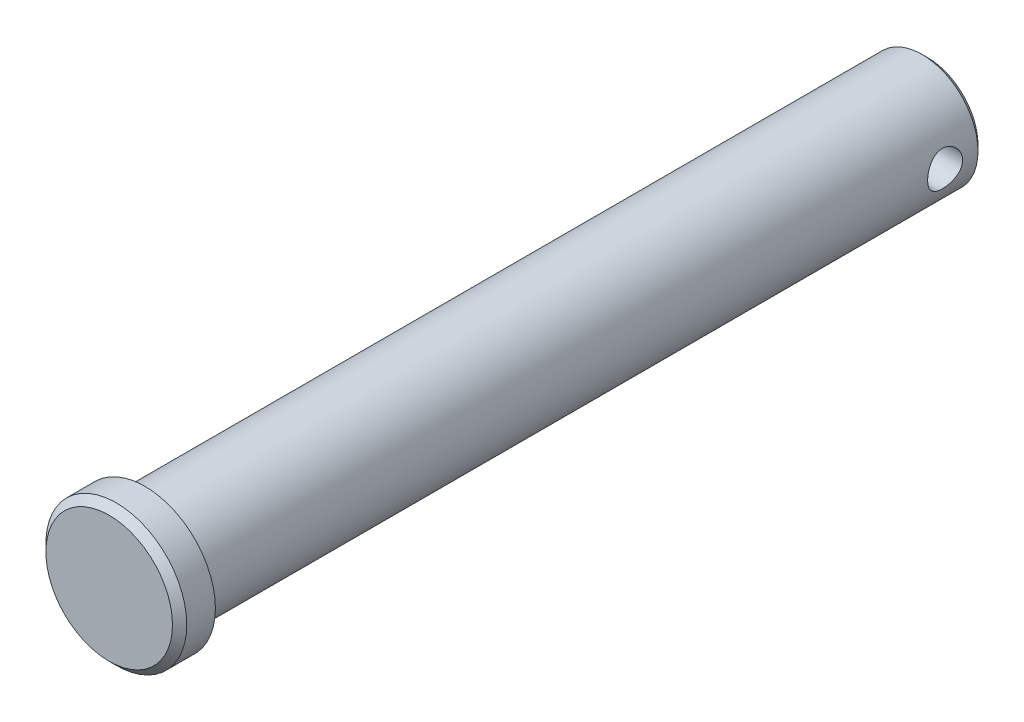
ISO-10303-21;
HEADER;
FILE_DESCRIPTION(('STEP AP214'),'2;1');
FILE_NAME('part.step','',(''),(''),'','','');
FILE_SCHEMA(('AUTOMOTIVE_DESIGN { 1 0 10303 214 1 1 1 1 }'));
ENDSEC;
DATA;
#1=APPLICATION_CONTEXT('core data for automotive mechanical design processes');
#2=APPLICATION_PROTOCOL_DEFINITION('international standard','automotive_design',2000,#1);
#3=PRODUCT_CONTEXT('',#1,'mechanical');
#4=PRODUCT('Part','Part','',(#3));
#5=PRODUCT_RELATED_PRODUCT_CATEGORY('part','',(#4));
#6=PRODUCT_DEFINITION_FORMATION('','',#4);
#7=PRODUCT_DEFINITION_CONTEXT('part definition',#1,'design');
#8=PRODUCT_DEFINITION('design','',#6,#7);
#9=PRODUCT_DEFINITION_SHAPE('','',#8);
#10=(LENGTH_UNIT() NAMED_UNIT(*) SI_UNIT(.MILLI.,.METRE.));
#11=(NAMED_UNIT(*) PLANE_ANGLE_UNIT() SI_UNIT($,.RADIAN.));
#12=(NAMED_UNIT(*) SI_UNIT($,.STERADIAN.) SOLID_ANGLE_UNIT());
#13=UNCERTAINTY_MEASURE_WITH_UNIT(LENGTH_MEASURE(1.E-05),#10,'distance_accuracy_value','');
#14=(GEOMETRIC_REPRESENTATION_CONTEXT(3) GLOBAL_UNCERTAINTY_ASSIGNED_CONTEXT((#13)) GLOBAL_UNIT_ASSIGNED_CONTEXT((#10,
#11,#12)) REPRESENTATION_CONTEXT('',''));
#15=CARTESIAN_POINT('',(0.,0.,0.));
#16=DIRECTION('',(0.,0.,1.));
#17=DIRECTION('',(1.,0.,0.));
#18=AXIS2_PLACEMENT_3D('',#15,#16,#17);
#19=CARTESIAN_POINT('',(0.,0.,44.45));
#20=DIRECTION('',(0.,0.,-1.));
#21=DIRECTION('',(-1.,0.,0.));
#22=AXIS2_PLACEMENT_3D('',#19,#20,#21);
#23=CYLINDRICAL_SURFACE('',#22,6.35);
#24=CARTESIAN_POINT('',(0.,0.,-43.815));
#25=DIRECTION('',(0.,0.,1.));
#26=DIRECTION('',(1.,0.,0.));
#27=AXIS2_PLACEMENT_3D('',#24,#25,#26);
#28=CIRCLE('',#27,6.35);
#29=CARTESIAN_POINT('',(6.35,0.,-43.815));
#30=VERTEX_POINT('',#29);
#31=EDGE_CURVE('E42',#30,#30,#28,.T.);
#32=ORIENTED_EDGE('',*,*,#31,.T.);
#33=EDGE_LOOP('',(#32));
#34=FACE_BOUND('',#33,.T.);
#35=CARTESIAN_POINT('',(-6.35,0.,-38.1));
#36=CARTESIAN_POINT('',(-6.34999945831309,-0.108647206464592,-38.1000007089578));
#37=CARTESIAN_POINT('',(-6.34718528288435,-0.217301845848289,-38.1089522727743));
#38=CARTESIAN_POINT('',(-6.3362346936598,-0.431433620221661,-38.1444281584436));
#39=CARTESIAN_POINT('',(-6.32809707517277,-0.536910030327377,-38.1709564579159));
#40=CARTESIAN_POINT('',(-6.30738857420431,-0.741566563045655,-38.2406038767732));
#41=CARTESIAN_POINT('',(-6.29482455629702,-0.840756155964964,-38.2836973158866));
#42=CARTESIAN_POINT('',(-6.26656051043234,-1.03050149872501,-38.3851424918144));
#43=CARTESIAN_POINT('',(-6.25085998841099,-1.12105588501875,-38.4434966329517));
#44=CARTESIAN_POINT('',(-6.21744714312698,-1.29375746923674,-38.5757038873276));
#45=CARTESIAN_POINT('',(-6.19969099034095,-1.3756005446987,-38.6499431550345));
#46=CARTESIAN_POINT('',(-6.16442198619056,-1.52590084398373,-38.8109910729565));
#47=CARTESIAN_POINT('',(-6.14690918068488,-1.59435557572668,-38.8978020580226));
#48=CARTESIAN_POINT('',(-6.11363942208348,-1.71758509166942,-39.0841619950453));
#49=CARTESIAN_POINT('',(-6.09793656429101,-1.77197994838329,-39.1839727455745));
#50=CARTESIAN_POINT('',(-6.07072385356284,-1.86308588959216,-39.3918953000337));
#51=CARTESIAN_POINT('',(-6.05921289629293,-1.89980163237962,-39.5000049085729));
#52=CARTESIAN_POINT('',(-6.04214576087895,-1.95339430138928,-39.7180245729552));
#53=CARTESIAN_POINT('',(-6.03642069525594,-1.97083537137485,-39.8277823642767));
#54=CARTESIAN_POINT('',(-6.03107212536259,-1.98714606121218,-40.0488040762726));
#55=CARTESIAN_POINT('',(-6.03144699898393,-1.98602061830787,-40.1600675886794));
#56=CARTESIAN_POINT('',(-6.03810687657258,-1.96567146763223,-40.376275705677));
#57=CARTESIAN_POINT('',(-6.04415767521694,-1.94716491867645,-40.4812962373052));
#58=CARTESIAN_POINT('',(-6.06110715723326,-1.89374166202056,-40.686660048503));
#59=CARTESIAN_POINT('',(-6.07200635582195,-1.85882321028223,-40.7870028297377));
#60=CARTESIAN_POINT('',(-6.09760407372696,-1.77306088556527,-40.9818712117868));
#61=CARTESIAN_POINT('',(-6.11235576899059,-1.72199181988554,-41.0762904194735));
#62=CARTESIAN_POINT('',(-6.14397197320861,-1.60553432921333,-41.2554543315081));
#63=CARTESIAN_POINT('',(-6.1608370305135,-1.54014218453003,-41.3401965140278));
#64=CARTESIAN_POINT('',(-6.19571925383283,-1.39337566476411,-41.5016552226745));
#65=CARTESIAN_POINT('',(-6.21375391749042,-1.31140925581609,-41.5778307979753));
#66=CARTESIAN_POINT('',(-6.24826618580834,-1.13564099785165,-41.7154866310578));
#67=CARTESIAN_POINT('',(-6.26474367505916,-1.04183827279156,-41.7769658001355));
#68=CARTESIAN_POINT('',(-6.29445805638179,-0.844017569113906,-41.8838502056545));
#69=CARTESIAN_POINT('',(-6.3076686877903,-0.739925664734353,-41.9291264150491));
#70=CARTESIAN_POINT('',(-6.3291712987783,-0.525094164729945,-42.0013653888519));
#71=CARTESIAN_POINT('',(-6.33746477178679,-0.414356598775313,-42.0283337140535));
#72=CARTESIAN_POINT('',(-6.34795830664584,-0.193968937198421,-42.0622698925941));
#73=CARTESIAN_POINT('',(-6.35038136346505,-0.0844420599522862,-42.0699700629547));
#74=CARTESIAN_POINT('',(-6.34952057072936,0.134350610350482,-42.0672161152132));
#75=CARTESIAN_POINT('',(-6.34623755485052,0.243616439211584,-42.0567646491254));
#76=CARTESIAN_POINT('',(-6.33448002484496,0.455960691099161,-42.0185919967374));
#77=CARTESIAN_POINT('',(-6.32613659063216,0.559125403243237,-41.9913065626652));
#78=CARTESIAN_POINT('',(-6.30523442689622,0.759383687067435,-41.9207722156178));
#79=CARTESIAN_POINT('',(-6.29267517679021,0.856476507212878,-41.8775213311103));
#80=CARTESIAN_POINT('',(-6.26425186630586,1.0444676955921,-41.775105018729));
#81=CARTESIAN_POINT('',(-6.24831470073048,1.13515733691312,-41.7155773073488));
#82=CARTESIAN_POINT('',(-6.21495788380444,1.30550578839941,-41.5827317789386));
#83=CARTESIAN_POINT('',(-6.19753783108521,1.38516159664477,-41.5094102218304));
#84=CARTESIAN_POINT('',(-6.16230979376987,1.53445759738394,-41.3476140120423));
#85=CARTESIAN_POINT('',(-6.14451378896476,1.60357585589005,-41.258654046314));
#86=CARTESIAN_POINT('',(-6.11127091014274,1.72594984764177,-41.0700114965019));
#87=CARTESIAN_POINT('',(-6.09582399881705,1.77920583282819,-40.9703290827572));
#88=CARTESIAN_POINT('',(-6.06919954450255,1.8680125752536,-40.7632770380681));
#89=CARTESIAN_POINT('',(-6.05800551091538,1.9036318854517,-40.6559390565208));
#90=CARTESIAN_POINT('',(-6.04124983715342,1.95616344729968,-40.4363674169678));
#91=CARTESIAN_POINT('',(-6.03568605378199,1.97308281744716,-40.3241356388046));
#92=CARTESIAN_POINT('',(-6.03104414683279,1.98722307276024,-40.1034185109661));
#93=CARTESIAN_POINT('',(-6.03168409802725,1.98530018899346,-39.9949932670172));
#94=CARTESIAN_POINT('',(-6.03869268471747,1.96387748779523,-39.7800915964047));
#95=CARTESIAN_POINT('',(-6.04506105297671,1.94437849030737,-39.6736150790673));
#96=CARTESIAN_POINT('',(-6.06261192516131,1.88893021237867,-39.4671644621479));
#97=CARTESIAN_POINT('',(-6.07372258377033,1.85322594819538,-39.3671179872643));
#98=CARTESIAN_POINT('',(-6.0994878050412,1.76657360894311,-39.1743558435148));
#99=CARTESIAN_POINT('',(-6.11414308847041,1.71562243305226,-39.0816416707005));
#100=CARTESIAN_POINT('',(-6.14606160665685,1.5975913408392,-38.9022495219268));
#101=CARTESIAN_POINT('',(-6.16340443915194,1.5299584196956,-38.8159495944184));
#102=CARTESIAN_POINT('',(-6.19837785628671,1.38145678179262,-38.6556467041222));
#103=CARTESIAN_POINT('',(-6.21600851675564,1.30058452472172,-38.5816470412267));
#104=CARTESIAN_POINT('',(-6.25026169224552,1.12472257723206,-38.4456264703489));
#105=CARTESIAN_POINT('',(-6.26683248997443,1.02935813699872,-38.3840756058857));
#106=CARTESIAN_POINT('',(-6.29644996258794,0.829118131596662,-38.2779604722161));
#107=CARTESIAN_POINT('',(-6.30949802226368,0.724246325500267,-38.2333895253498));
#108=CARTESIAN_POINT('',(-6.32969033039384,0.517124371156184,-38.1657362039216));
#109=CARTESIAN_POINT('',(-6.3372403227975,0.415401660166161,-38.1411561481528));
#110=CARTESIAN_POINT('',(-6.34739491790518,0.209121209011389,-38.1082893535513));
#111=CARTESIAN_POINT('',(-6.35000052132933,0.104564046871732,-38.0999993176861));
#112=CARTESIAN_POINT('',(-6.35,0.,-38.1));
#113=B_SPLINE_CURVE_WITH_KNOTS('',3,(#35,#36,#37,#38,#39,#40,#41,#42,#43,#44,#45,#46,#47,#48,
#49,#50,#51,#52,#53,#54,#55,#56,#57,#58,#59,#60,#61,#62,#63,#64,#65,#66,#67,#68,#69,#70,#71,#72,
#73,#74,#75,#76,#77,#78,#79,#80,#81,#82,#83,#84,#85,#86,#87,#88,#89,#90,#91,#92,#93,#94,#95,#96,
#97,#98,#99,#100,#101,#102,#103,#104,#105,#106,#107,#108,#109,#110,#111,#112),.UNSPECIFIED.,.T.,
.F.,(4,2,2,2,2,2,2,2,2,2,2,2,2,2,2,2,2,2,2,2,2,2,2,2,2,2,2,2,2,2,2,2,2,2,2,2,2,2,4),(0.,
0.32555727597411,0.651188250816643,0.976316435733869,1.30149587547395,1.63572542734814,
1.97001713297151,2.31257111855396,2.65503479468749,2.98718525890446,3.31924739843532,
3.63818356407693,3.95715362966762,4.28078332818866,4.60449717291444,4.94294711306365,
5.28142211768618,5.62253543845009,5.96354510385103,6.29138265070326,6.61917230343362,
6.93881369922558,7.25849457992267,7.58596915522118,7.91353265063448,8.25407573707107,
8.59461341436641,8.93381683758451,9.27289109187025,9.59663123029782,9.92035626670002,
10.2393418753237,10.558392401393,10.8899247850025,11.2215459684533,11.5639956066583,
11.9063104309797,12.2196961069948,12.5330183485149),.UNSPECIFIED.);
#114=CARTESIAN_POINT('',(-6.35,0.,-38.1));
#115=VERTEX_POINT('',#114);
#116=EDGE_CURVE('E53',#115,#115,#113,.T.);
#117=ORIENTED_EDGE('',*,*,#116,.T.);
#118=EDGE_LOOP('',(#117));
#119=FACE_BOUND('',#118,.T.);
#120=CARTESIAN_POINT('',(6.35,0.,-42.06875));
#121=CARTESIAN_POINT('',(6.34999945831309,-0.108647206464593,-42.0687492910422));
#122=CARTESIAN_POINT('',(6.34718528288435,-0.217301845848289,-42.0597977272257));
#123=CARTESIAN_POINT('',(6.3362346936598,-0.431433620221662,-42.0243218415565));
#124=CARTESIAN_POINT('',(6.32809707517277,-0.536910030327377,-41.9977935420841));
#125=CARTESIAN_POINT('',(6.30738857420431,-0.741566563045655,-41.9281461232268));
#126=CARTESIAN_POINT('',(6.29482455629702,-0.840756155964964,-41.8850526841134));
#127=CARTESIAN_POINT('',(6.26656051043234,-1.03050149872501,-41.7836075081857));
#128=CARTESIAN_POINT('',(6.25085998841099,-1.12105588501875,-41.7252533670483));
#129=CARTESIAN_POINT('',(6.21744714312698,-1.29375746923674,-41.5930461126724));
#130=CARTESIAN_POINT('',(6.19969099034095,-1.3756005446987,-41.5188068449655));
#131=CARTESIAN_POINT('',(6.16442198619056,-1.52590084398373,-41.3577589270435));
#132=CARTESIAN_POINT('',(6.14690918068488,-1.59435557572668,-41.2709479419774));
#133=CARTESIAN_POINT('',(6.11363942208348,-1.71758509166942,-41.0845880049547));
#134=CARTESIAN_POINT('',(6.09793656429101,-1.77197994838329,-40.9847772544255));
#135=CARTESIAN_POINT('',(6.07072385356284,-1.86308588959216,-40.7768546999663));
#136=CARTESIAN_POINT('',(6.05921289629293,-1.89980163237962,-40.6687450914271));
#137=CARTESIAN_POINT('',(6.04214576087895,-1.95339430138928,-40.4507254270449));
#138=CARTESIAN_POINT('',(6.03642069525594,-1.97083537137485,-40.3409676357233));
#139=CARTESIAN_POINT('',(6.03107212536259,-1.98714606121218,-40.1199459237274));
#140=CARTESIAN_POINT('',(6.03144699898393,-1.98602061830787,-40.0086824113206));
#141=CARTESIAN_POINT('',(6.03810687657258,-1.96567146763223,-39.792474294323));
#142=CARTESIAN_POINT('',(6.04415767521694,-1.94716491867645,-39.6874537626948));
#143=CARTESIAN_POINT('',(6.06110715723326,-1.89374166202056,-39.482089951497));
#144=CARTESIAN_POINT('',(6.07200635582195,-1.85882321028223,-39.3817471702623));
#145=CARTESIAN_POINT('',(6.09760407372696,-1.77306088556527,-39.1868787882132));
#146=CARTESIAN_POINT('',(6.11235576899059,-1.72199181988554,-39.0924595805265));
#147=CARTESIAN_POINT('',(6.14397197320861,-1.60553432921333,-38.9132956684919));
#148=CARTESIAN_POINT('',(6.1608370305135,-1.54014218453003,-38.8285534859722));
#149=CARTESIAN_POINT('',(6.19571925383283,-1.39337566476411,-38.6670947773255));
#150=CARTESIAN_POINT('',(6.21375391749042,-1.31140925581609,-38.5909192020248));
#151=CARTESIAN_POINT('',(6.24826618580834,-1.13564099785165,-38.4532633689423));
#152=CARTESIAN_POINT('',(6.26474367505916,-1.04183827279156,-38.3917841998645));
#153=CARTESIAN_POINT('',(6.29445805638179,-0.844017569113907,-38.2848997943455));
#154=CARTESIAN_POINT('',(6.3076686877903,-0.739925664734353,-38.239623584951));
#155=CARTESIAN_POINT('',(6.32917129877829,-0.525094164729945,-38.1673846111481));
#156=CARTESIAN_POINT('',(6.33746477178679,-0.414356598775313,-38.1404162859466));
#157=CARTESIAN_POINT('',(6.34795830664584,-0.193968937198421,-38.1064801074059));
#158=CARTESIAN_POINT('',(6.35038136346505,-0.0844420599522868,-38.0987799370453));
#159=CARTESIAN_POINT('',(6.34952057072936,0.134350610350481,-38.1015338847868));
#160=CARTESIAN_POINT('',(6.34623755485052,0.243616439211584,-38.1119853508747));
#161=CARTESIAN_POINT('',(6.33448002484496,0.45596069109916,-38.1501580032627));
#162=CARTESIAN_POINT('',(6.32613659063216,0.559125403243237,-38.1774434373348));
#163=CARTESIAN_POINT('',(6.30523442689622,0.759383687067435,-38.2479777843822));
#164=CARTESIAN_POINT('',(6.29267517679021,0.856476507212878,-38.2912286688897));
#165=CARTESIAN_POINT('',(6.26425186630586,1.0444676955921,-38.393644981271));
#166=CARTESIAN_POINT('',(6.24831470073048,1.13515733691312,-38.4531726926512));
#167=CARTESIAN_POINT('',(6.21495788380444,1.30550578839941,-38.5860182210614));
#168=CARTESIAN_POINT('',(6.19753783108521,1.38516159664477,-38.6593397781696));
#169=CARTESIAN_POINT('',(6.16230979376987,1.53445759738394,-38.8211359879577));
#170=CARTESIAN_POINT('',(6.14451378896476,1.60357585589006,-38.910095953686));
#171=CARTESIAN_POINT('',(6.11127091014274,1.72594984764178,-39.0987385034981));
#172=CARTESIAN_POINT('',(6.09582399881705,1.77920583282819,-39.1984209172428));
#173=CARTESIAN_POINT('',(6.06919954450255,1.8680125752536,-39.4054729619319));
#174=CARTESIAN_POINT('',(6.05800551091538,1.9036318854517,-39.5128109434792));
#175=CARTESIAN_POINT('',(6.04124983715342,1.95616344729968,-39.7323825830322));
#176=CARTESIAN_POINT('',(6.03568605378199,1.97308281744716,-39.8446143611954));
#177=CARTESIAN_POINT('',(6.03104414683279,1.98722307276024,-40.0653314890339));
#178=CARTESIAN_POINT('',(6.03168409802725,1.98530018899346,-40.1737567329828));
#179=CARTESIAN_POINT('',(6.03869268471747,1.96387748779523,-40.3886584035953));
#180=CARTESIAN_POINT('',(6.04506105297671,1.94437849030737,-40.4951349209327));
#181=CARTESIAN_POINT('',(6.06261192516131,1.88893021237867,-40.7015855378521));
#182=CARTESIAN_POINT('',(6.07372258377033,1.85322594819538,-40.8016320127357));
#183=CARTESIAN_POINT('',(6.0994878050412,1.76657360894311,-40.9943941564852));
#184=CARTESIAN_POINT('',(6.11414308847041,1.71562243305226,-41.0871083292995));
#185=CARTESIAN_POINT('',(6.14606160665685,1.5975913408392,-41.2665004780732));
#186=CARTESIAN_POINT('',(6.16340443915194,1.5299584196956,-41.3528004055816));
#187=CARTESIAN_POINT('',(6.19837785628671,1.38145678179262,-41.5131032958778));
#188=CARTESIAN_POINT('',(6.21600851675564,1.30058452472172,-41.5871029587733));
#189=CARTESIAN_POINT('',(6.25026169224552,1.12472257723206,-41.7231235296512));
#190=CARTESIAN_POINT('',(6.26683248997443,1.02935813699872,-41.7846743941143));
#191=CARTESIAN_POINT('',(6.29644996258794,0.829118131596662,-41.8907895277839));
#192=CARTESIAN_POINT('',(6.30949802226368,0.724246325500267,-41.9353604746502));
#193=CARTESIAN_POINT('',(6.32969033039384,0.517124371156185,-42.0030137960784));
#194=CARTESIAN_POINT('',(6.3372403227975,0.415401660166162,-42.0275938518472));
#195=CARTESIAN_POINT('',(6.34739491790518,0.20912120901139,-42.0604606464487));
#196=CARTESIAN_POINT('',(6.35000052132933,0.104564046871732,-42.0687506823139));
#197=CARTESIAN_POINT('',(6.35,0.,-42.06875));
#198=B_SPLINE_CURVE_WITH_KNOTS('',3,(#120,#121,#122,#123,#124,#125,#126,#127,#128,#129,#130,
#131,#132,#133,#134,#135,#136,#137,#138,#139,#140,#141,#142,#143,#144,#145,#146,#147,#148,#149,
#150,#151,#152,#153,#154,#155,#156,#157,#158,#159,#160,#161,#162,#163,#164,#165,#166,#167,#168,
#169,#170,#171,#172,#173,#174,#175,#176,#177,#178,#179,#180,#181,#182,#183,#184,#185,#186,#187,
#188,#189,#190,#191,#192,#193,#194,#195,#196,#197),.UNSPECIFIED.,.T.,.F.,(4,2,2,2,2,2,2,2,2,2,2,
2,2,2,2,2,2,2,2,2,2,2,2,2,2,2,2,2,2,2,2,2,2,2,2,2,2,2,4),(0.,0.32555727597411,0.651188250816642,
0.976316435733868,1.30149587547395,1.63572542734814,1.97001713297151,2.31257111855396,
2.65503479468749,2.98718525890446,3.31924739843532,3.63818356407693,3.95715362966762,
4.28078332818865,4.60449717291444,4.94294711306365,5.28142211768618,5.62253543845009,
5.96354510385103,6.29138265070325,6.61917230343362,6.93881369922558,7.25849457992267,
7.58596915522117,7.91353265063448,8.25407573707109,8.59461341436641,8.93381683758451,
9.27289109187025,9.59663123029781,9.92035626670002,10.2393418753237,10.558392401393,
10.8899247850025,11.2215459684533,11.5639956066583,11.9063104309797,12.2196961069948,
12.5330183485149),.UNSPECIFIED.);
#199=CARTESIAN_POINT('',(6.35,0.,-42.06875));
#200=VERTEX_POINT('',#199);
#201=EDGE_CURVE('E61',#200,#200,#198,.T.);
#202=ORIENTED_EDGE('',*,*,#201,.T.);
#203=EDGE_LOOP('',(#202));
#204=FACE_BOUND('',#203,.T.);
#205=CARTESIAN_POINT('',(0.,0.,44.45));
#206=DIRECTION('',(0.,0.,1.));
#207=DIRECTION('',(1.,0.,0.));
#208=AXIS2_PLACEMENT_3D('',#205,#206,#207);
#209=CIRCLE('',#208,6.35);
#210=CARTESIAN_POINT('',(6.35,0.,44.45));
#211=VERTEX_POINT('',#210);
#212=EDGE_CURVE('E99',#211,#211,#209,.T.);
#213=ORIENTED_EDGE('',*,*,#212,.F.);
#214=EDGE_LOOP('',(#213));
#215=FACE_BOUND('',#214,.T.);
#216=ADVANCED_FACE('F35',(#34,#119,#204,#215),#23,.T.);
#217=CARTESIAN_POINT('',(0.,0.,-44.45));
#218=DIRECTION('',(0.,0.,1.));
#219=DIRECTION('',(1.,0.,0.));
#220=AXIS2_PLACEMENT_3D('',#217,#218,#219);
#221=PLANE('',#220);
#222=CARTESIAN_POINT('',(0.,0.,-44.45));
#223=DIRECTION('',(0.,0.,1.));
#224=DIRECTION('',(1.,0.,0.));
#225=AXIS2_PLACEMENT_3D('',#222,#223,#224);
#226=CIRCLE('',#225,5.71499999999998);
#227=CARTESIAN_POINT('',(5.71499999999998,0.,-44.45));
#228=VERTEX_POINT('',#227);
#229=EDGE_CURVE('E10',#228,#228,#226,.F.);
#230=ORIENTED_EDGE('',*,*,#229,.T.);
#231=EDGE_LOOP('',(#230));
#232=FACE_BOUND('',#231,.T.);
#233=ADVANCED_FACE('F81',(#232),#221,.F.);
#234=CARTESIAN_POINT('',(0.,0.,44.45));
#235=DIRECTION('',(0.,0.,1.));
#236=DIRECTION('',(1.,0.,0.));
#237=AXIS2_PLACEMENT_3D('',#234,#235,#236);
#238=PLANE('',#237);
#239=CARTESIAN_POINT('',(0.,0.,44.45));
#240=DIRECTION('',(0.,0.,1.));
#241=DIRECTION('',(1.,0.,0.));
#242=AXIS2_PLACEMENT_3D('',#239,#240,#241);
#243=CIRCLE('',#242,8.001);
#244=CARTESIAN_POINT('',(8.001,0.,44.45));
#245=VERTEX_POINT('',#244);
#246=EDGE_CURVE('E60',#245,#245,#243,.T.);
#247=ORIENTED_EDGE('',*,*,#246,.F.);
#248=EDGE_LOOP('',(#247));
#249=FACE_BOUND('',#248,.T.);
#250=ORIENTED_EDGE('',*,*,#212,.T.);
#251=EDGE_LOOP('',(#250));
#252=FACE_BOUND('',#251,.T.);
#253=ADVANCED_FACE('F78',(#249,#252),#238,.F.);
#254=CARTESIAN_POINT('',(0.,0.,48.514));
#255=DIRECTION('',(0.,0.,-1.));
#256=DIRECTION('',(-1.,0.,0.));
#257=AXIS2_PLACEMENT_3D('',#254,#255,#256);
#258=CYLINDRICAL_SURFACE('',#257,8.001);
#259=CARTESIAN_POINT('',(0.,0.,47.7012));
#260=DIRECTION('',(0.,0.,1.));
#261=DIRECTION('',(1.,0.,0.));
#262=AXIS2_PLACEMENT_3D('',#259,#260,#261);
#263=CIRCLE('',#262,8.001);
#264=CARTESIAN_POINT('',(8.001,0.,47.7012));
#265=VERTEX_POINT('',#264);
#266=EDGE_CURVE('E46',#265,#265,#263,.F.);
#267=ORIENTED_EDGE('',*,*,#266,.T.);
#268=EDGE_LOOP('',(#267));
#269=FACE_BOUND('',#268,.T.);
#270=ORIENTED_EDGE('',*,*,#246,.T.);
#271=EDGE_LOOP('',(#270));
#272=FACE_BOUND('',#271,.T.);
#273=ADVANCED_FACE('F76',(#269,#272),#258,.T.);
#274=CARTESIAN_POINT('',(0.,0.,48.514));
#275=DIRECTION('',(0.,0.,1.));
#276=DIRECTION('',(1.,0.,0.));
#277=AXIS2_PLACEMENT_3D('',#274,#275,#276);
#278=PLANE('',#277);
#279=CARTESIAN_POINT('',(0.,0.,48.514));
#280=DIRECTION('',(0.,0.,1.));
#281=DIRECTION('',(1.,0.,0.));
#282=AXIS2_PLACEMENT_3D('',#279,#280,#281);
#283=CIRCLE('',#282,7.18819999999999);
#284=CARTESIAN_POINT('',(7.18819999999999,0.,48.514));
#285=VERTEX_POINT('',#284);
#286=EDGE_CURVE('E50',#285,#285,#283,.T.);
#287=ORIENTED_EDGE('',*,*,#286,.T.);
#288=EDGE_LOOP('',(#287));
#289=FACE_BOUND('',#288,.T.);
#290=ADVANCED_FACE('F72',(#289),#278,.T.);
#291=CARTESIAN_POINT('',(0.,0.,48.514));
#292=DIRECTION('',(0.,0.,-1.));
#293=DIRECTION('',(-1.,0.,0.));
#294=AXIS2_PLACEMENT_3D('',#291,#292,#293);
#295=CONICAL_SURFACE('',#294,7.18819999999999,0.785398163397439);
#296=ORIENTED_EDGE('',*,*,#266,.F.);
#297=EDGE_LOOP('',(#296));
#298=FACE_BOUND('',#297,.T.);
#299=ORIENTED_EDGE('',*,*,#286,.F.);
#300=EDGE_LOOP('',(#299));
#301=FACE_BOUND('',#300,.T.);
#302=ADVANCED_FACE('F70',(#298,#301),#295,.T.);
#303=CARTESIAN_POINT('',(-8.001,0.,-40.084375));
#304=DIRECTION('',(1.,0.,0.));
#305=DIRECTION('',(0.,0.,-1.));
#306=AXIS2_PLACEMENT_3D('',#303,#304,#305);
#307=CYLINDRICAL_SURFACE('',#306,1.984375);
#308=ORIENTED_EDGE('',*,*,#201,.F.);
#309=EDGE_LOOP('',(#308));
#310=FACE_BOUND('',#309,.T.);
#311=ORIENTED_EDGE('',*,*,#116,.F.);
#312=EDGE_LOOP('',(#311));
#313=FACE_BOUND('',#312,.T.);
#314=ADVANCED_FACE('F66',(#310,#313),#307,.F.);
#315=CARTESIAN_POINT('',(0.,0.,-43.815));
#316=DIRECTION('',(0.,0.,1.));
#317=DIRECTION('',(1.,0.,0.));
#318=AXIS2_PLACEMENT_3D('',#315,#316,#317);
#319=CONICAL_SURFACE('',#318,6.35,0.785398163397452);
#320=ORIENTED_EDGE('',*,*,#229,.F.);
#321=EDGE_LOOP('',(#320));
#322=FACE_BOUND('',#321,.T.);
#323=ORIENTED_EDGE('',*,*,#31,.F.);
#324=EDGE_LOOP('',(#323));
#325=FACE_BOUND('',#324,.T.);
#326=ADVANCED_FACE('F37',(#322,#325),#319,.T.);
#327=CLOSED_SHELL('',(#216,#233,#253,#273,#290,#302,#314,#326));
#328=MANIFOLD_SOLID_BREP('B2',#327);
#329=ADVANCED_BREP_SHAPE_REPRESENTATION('',(#18,#328),#14);
#330=SHAPE_DEFINITION_REPRESENTATION(#9,#329);
ENDSEC;
END-ISO-10303-21;
